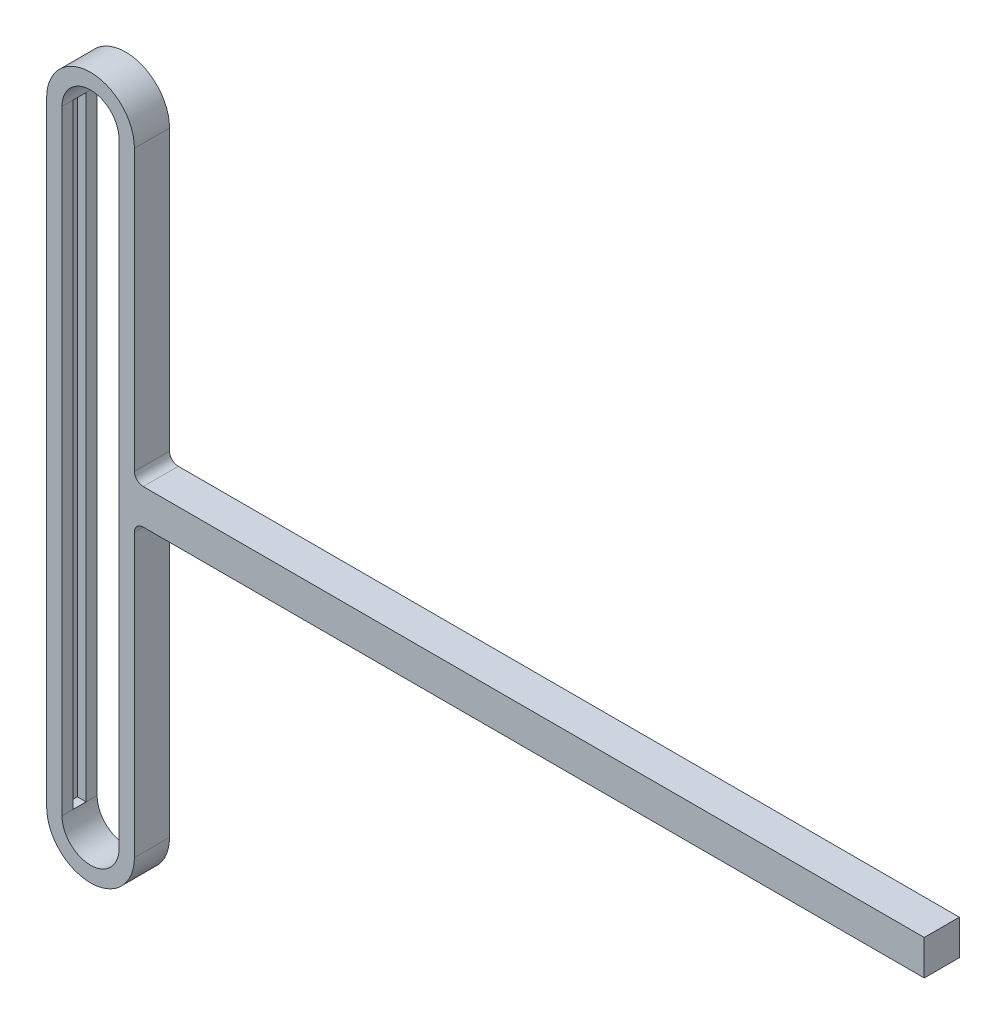
ISO-10303-21;
HEADER;
FILE_DESCRIPTION(('STEP AP214'),'2;1');
FILE_NAME('part.step','',(''),(''),'','','');
FILE_SCHEMA(('AUTOMOTIVE_DESIGN { 1 0 10303 214 1 1 1 1 }'));
ENDSEC;
DATA;
#1=APPLICATION_CONTEXT('core data for automotive mechanical design processes');
#2=APPLICATION_PROTOCOL_DEFINITION('international standard','automotive_design',2000,#1);
#3=PRODUCT_CONTEXT('',#1,'mechanical');
#4=PRODUCT('Part','Part','',(#3));
#5=PRODUCT_RELATED_PRODUCT_CATEGORY('part','',(#4));
#6=PRODUCT_DEFINITION_FORMATION('','',#4);
#7=PRODUCT_DEFINITION_CONTEXT('part definition',#1,'design');
#8=PRODUCT_DEFINITION('design','',#6,#7);
#9=PRODUCT_DEFINITION_SHAPE('','',#8);
#10=(LENGTH_UNIT() NAMED_UNIT(*) SI_UNIT(.MILLI.,.METRE.));
#11=(NAMED_UNIT(*) PLANE_ANGLE_UNIT() SI_UNIT($,.RADIAN.));
#12=(NAMED_UNIT(*) SI_UNIT($,.STERADIAN.) SOLID_ANGLE_UNIT());
#13=UNCERTAINTY_MEASURE_WITH_UNIT(LENGTH_MEASURE(1.E-05),#10,'distance_accuracy_value','');
#14=(GEOMETRIC_REPRESENTATION_CONTEXT(3) GLOBAL_UNCERTAINTY_ASSIGNED_CONTEXT((#13)) GLOBAL_UNIT_ASSIGNED_CONTEXT((#10,
#11,#12)) REPRESENTATION_CONTEXT('',''));
#15=CARTESIAN_POINT('',(0.,0.,0.));
#16=DIRECTION('',(0.,0.,1.));
#17=DIRECTION('',(1.,0.,0.));
#18=AXIS2_PLACEMENT_3D('',#15,#16,#17);
#19=CARTESIAN_POINT('',(50.,400.,40.));
#20=DIRECTION('',(-1.,0.,0.));
#21=DIRECTION('',(0.,-1.,0.));
#22=AXIS2_PLACEMENT_3D('',#19,#20,#21);
#23=PLANE('',#22);
#24=DIRECTION('',(0.,1.,0.));
#25=VECTOR('',#24,1.);
#26=CARTESIAN_POINT('',(50.,400.,40.));
#27=LINE('',#26,#25);
#28=CARTESIAN_POINT('',(50.,31.1797799288488,40.));
#29=VERTEX_POINT('',#28);
#30=CARTESIAN_POINT('',(50.,350.,40.));
#31=VERTEX_POINT('',#30);
#32=EDGE_CURVE('E367',#29,#31,#27,.T.);
#33=ORIENTED_EDGE('',*,*,#32,.F.);
#34=DIRECTION('',(0.,0.,1.));
#35=VECTOR('',#34,1.);
#36=CARTESIAN_POINT('',(50.,31.1797799288488,0.));
#37=LINE('',#36,#35);
#38=CARTESIAN_POINT('',(50.,31.1797799288488,0.));
#39=VERTEX_POINT('',#38);
#40=EDGE_CURVE('E63',#29,#39,#37,.F.);
#41=ORIENTED_EDGE('',*,*,#40,.T.);
#42=DIRECTION('',(0.,1.,0.));
#43=VECTOR('',#42,1.);
#44=CARTESIAN_POINT('',(50.,400.,0.));
#45=LINE('',#44,#43);
#46=CARTESIAN_POINT('',(50.,350.,0.));
#47=VERTEX_POINT('',#46);
#48=EDGE_CURVE('E346',#39,#47,#45,.T.);
#49=ORIENTED_EDGE('',*,*,#48,.T.);
#50=DIRECTION('',(0.,0.,-1.));
#51=VECTOR('',#50,1.);
#52=CARTESIAN_POINT('',(50.,350.,40.));
#53=LINE('',#52,#51);
#54=EDGE_CURVE('E371',#47,#31,#53,.F.);
#55=ORIENTED_EDGE('',*,*,#54,.T.);
#56=EDGE_LOOP('',(#33,#41,#49,#55));
#57=FACE_BOUND('',#56,.T.);
#58=ADVANCED_FACE('F41',(#57),#23,.F.);
#59=CARTESIAN_POINT('',(50.,-350.,0.));
#60=VERTEX_POINT('',#59);
#61=CARTESIAN_POINT('',(50.,-28.8202200711512,0.));
#62=VERTEX_POINT('',#61);
#63=EDGE_CURVE('E372',#60,#62,#45,.T.);
#64=ORIENTED_EDGE('',*,*,#63,.T.);
#65=DIRECTION('',(0.,0.,-1.));
#66=VECTOR('',#65,1.);
#67=CARTESIAN_POINT('',(50.,-28.8202200711512,40.));
#68=LINE('',#67,#66);
#69=CARTESIAN_POINT('',(50.,-28.8202200711512,40.));
#70=VERTEX_POINT('',#69);
#71=EDGE_CURVE('E412',#62,#70,#68,.F.);
#72=ORIENTED_EDGE('',*,*,#71,.T.);
#73=CARTESIAN_POINT('',(50.,-350.,40.));
#74=VERTEX_POINT('',#73);
#75=EDGE_CURVE('E362',#74,#70,#27,.T.);
#76=ORIENTED_EDGE('',*,*,#75,.F.);
#77=DIRECTION('',(0.,0.,-1.));
#78=VECTOR('',#77,1.);
#79=CARTESIAN_POINT('',(50.,-350.,40.));
#80=LINE('',#79,#78);
#81=EDGE_CURVE('E398',#74,#60,#80,.T.);
#82=ORIENTED_EDGE('',*,*,#81,.T.);
#83=EDGE_LOOP('',(#64,#72,#76,#82));
#84=FACE_BOUND('',#83,.T.);
#85=ADVANCED_FACE('F481',(#84),#23,.F.);
#86=CARTESIAN_POINT('',(32.5,350.,40.));
#87=DIRECTION('',(1.,0.,0.));
#88=DIRECTION('',(0.,0.,-1.));
#89=AXIS2_PLACEMENT_3D('',#86,#87,#88);
#90=PLANE('',#89);
#91=DIRECTION('',(0.,1.,0.));
#92=VECTOR('',#91,1.);
#93=CARTESIAN_POINT('',(32.5,350.,12.5000000000001));
#94=LINE('',#93,#92);
#95=CARTESIAN_POINT('',(32.5000000000001,-350.,12.5));
#96=VERTEX_POINT('',#95);
#97=CARTESIAN_POINT('',(32.5,350.,12.5000000000001));
#98=VERTEX_POINT('',#97);
#99=EDGE_CURVE('E216',#96,#98,#94,.T.);
#100=ORIENTED_EDGE('',*,*,#99,.T.);
#101=DIRECTION('',(0.,0.,-1.));
#102=VECTOR('',#101,1.);
#103=CARTESIAN_POINT('',(32.5,350.,40.));
#104=LINE('',#103,#102);
#105=CARTESIAN_POINT('',(32.5,350.,0.));
#106=VERTEX_POINT('',#105);
#107=EDGE_CURVE('E352',#98,#106,#104,.T.);
#108=ORIENTED_EDGE('',*,*,#107,.T.);
#109=DIRECTION('',(0.,-1.,0.));
#110=VECTOR('',#109,1.);
#111=CARTESIAN_POINT('',(32.5,350.,0.));
#112=LINE('',#111,#110);
#113=CARTESIAN_POINT('',(32.5,-350.,0.));
#114=VERTEX_POINT('',#113);
#115=EDGE_CURVE('E315',#106,#114,#112,.T.);
#116=ORIENTED_EDGE('',*,*,#115,.T.);
#117=DIRECTION('',(0.,0.,-1.));
#118=VECTOR('',#117,1.);
#119=CARTESIAN_POINT('',(32.5,-350.,40.));
#120=LINE('',#119,#118);
#121=EDGE_CURVE('E347',#96,#114,#120,.T.);
#122=ORIENTED_EDGE('',*,*,#121,.F.);
#123=EDGE_LOOP('',(#100,#108,#116,#122));
#124=FACE_BOUND('',#123,.T.);
#125=ADVANCED_FACE('F486',(#124),#90,.F.);
#126=DIRECTION('',(0.,-1.,0.));
#127=VECTOR('',#126,1.);
#128=CARTESIAN_POINT('',(32.5,350.,27.5000000000001));
#129=LINE('',#128,#127);
#130=CARTESIAN_POINT('',(32.5,350.,27.5));
#131=VERTEX_POINT('',#130);
#132=CARTESIAN_POINT('',(32.5000000000001,-350.,27.5));
#133=VERTEX_POINT('',#132);
#134=EDGE_CURVE('E245',#131,#133,#129,.T.);
#135=ORIENTED_EDGE('',*,*,#134,.T.);
#136=CARTESIAN_POINT('',(32.5,-350.,40.));
#137=VERTEX_POINT('',#136);
#138=EDGE_CURVE('E342',#137,#133,#120,.T.);
#139=ORIENTED_EDGE('',*,*,#138,.F.);
#140=DIRECTION('',(0.,-1.,0.));
#141=VECTOR('',#140,1.);
#142=CARTESIAN_POINT('',(32.5,350.,40.));
#143=LINE('',#142,#141);
#144=CARTESIAN_POINT('',(32.5,350.,40.));
#145=VERTEX_POINT('',#144);
#146=EDGE_CURVE('E323',#145,#137,#143,.T.);
#147=ORIENTED_EDGE('',*,*,#146,.F.);
#148=EDGE_CURVE('E348',#145,#131,#104,.T.);
#149=ORIENTED_EDGE('',*,*,#148,.T.);
#150=EDGE_LOOP('',(#135,#139,#147,#149));
#151=FACE_BOUND('',#150,.T.);
#152=ADVANCED_FACE('F553',(#151),#90,.F.);
#153=CARTESIAN_POINT('',(-32.5,350.,40.));
#154=DIRECTION('',(-1.,0.,0.));
#155=DIRECTION('',(0.,-1.,0.));
#156=AXIS2_PLACEMENT_3D('',#153,#154,#155);
#157=PLANE('',#156);
#158=DIRECTION('',(0.,0.,-1.));
#159=VECTOR('',#158,1.);
#160=CARTESIAN_POINT('',(-32.5,350.,40.));
#161=LINE('',#160,#159);
#162=CARTESIAN_POINT('',(-32.5,350.,12.5000000000001));
#163=VERTEX_POINT('',#162);
#164=CARTESIAN_POINT('',(-32.5,350.,0.));
#165=VERTEX_POINT('',#164);
#166=EDGE_CURVE('E357',#163,#165,#161,.T.);
#167=ORIENTED_EDGE('',*,*,#166,.F.);
#168=DIRECTION('',(0.,1.,0.));
#169=VECTOR('',#168,1.);
#170=CARTESIAN_POINT('',(-32.5,350.,12.5000000000001));
#171=LINE('',#170,#169);
#172=CARTESIAN_POINT('',(-32.5000000000001,-350.,12.5));
#173=VERTEX_POINT('',#172);
#174=EDGE_CURVE('E256',#173,#163,#171,.T.);
#175=ORIENTED_EDGE('',*,*,#174,.F.);
#176=DIRECTION('',(0.,0.,-1.));
#177=VECTOR('',#176,1.);
#178=CARTESIAN_POINT('',(-32.5000000000001,-350.,40.));
#179=LINE('',#178,#177);
#180=CARTESIAN_POINT('',(-32.5000000000001,-350.,0.));
#181=VERTEX_POINT('',#180);
#182=EDGE_CURVE('E327',#173,#181,#179,.T.);
#183=ORIENTED_EDGE('',*,*,#182,.T.);
#184=DIRECTION('',(0.,1.,0.));
#185=VECTOR('',#184,1.);
#186=CARTESIAN_POINT('',(-32.5,350.,0.));
#187=LINE('',#186,#185);
#188=EDGE_CURVE('E331',#181,#165,#187,.T.);
#189=ORIENTED_EDGE('',*,*,#188,.T.);
#190=EDGE_LOOP('',(#167,#175,#183,#189));
#191=FACE_BOUND('',#190,.T.);
#192=ADVANCED_FACE('F436',(#191),#157,.F.);
#193=CARTESIAN_POINT('',(0.,-350.,0.));
#194=DIRECTION('',(0.,0.,-1.));
#195=DIRECTION('',(-1.,0.,0.));
#196=AXIS2_PLACEMENT_3D('',#193,#194,#195);
#197=CYLINDRICAL_SURFACE('',#196,50.);
#198=DIRECTION('',(0.,0.,-1.));
#199=VECTOR('',#198,1.);
#200=CARTESIAN_POINT('',(-50.,-350.,40.));
#201=LINE('',#200,#199);
#202=CARTESIAN_POINT('',(-50.,-350.,0.));
#203=VERTEX_POINT('',#202);
#204=CARTESIAN_POINT('',(-50.,-350.,40.));
#205=VERTEX_POINT('',#204);
#206=EDGE_CURVE('E394',#203,#205,#201,.F.);
#207=ORIENTED_EDGE('',*,*,#206,.F.);
#208=CARTESIAN_POINT('',(0.,-350.,0.));
#209=DIRECTION('',(0.,0.,1.));
#210=DIRECTION('',(1.,0.,0.));
#211=AXIS2_PLACEMENT_3D('',#208,#209,#210);
#212=CIRCLE('',#211,50.);
#213=EDGE_CURVE('E402',#60,#203,#212,.F.);
#214=ORIENTED_EDGE('',*,*,#213,.F.);
#215=ORIENTED_EDGE('',*,*,#81,.F.);
#216=CARTESIAN_POINT('',(0.,-350.,40.));
#217=DIRECTION('',(0.,0.,1.));
#218=DIRECTION('',(1.,0.,0.));
#219=AXIS2_PLACEMENT_3D('',#216,#217,#218);
#220=CIRCLE('',#219,50.);
#221=EDGE_CURVE('E405',#205,#74,#220,.T.);
#222=ORIENTED_EDGE('',*,*,#221,.F.);
#223=EDGE_LOOP('',(#207,#214,#215,#222));
#224=FACE_BOUND('',#223,.T.);
#225=ADVANCED_FACE('F499',(#224),#197,.T.);
#226=CARTESIAN_POINT('',(0.,350.,0.));
#227=DIRECTION('',(0.,0.,-1.));
#228=DIRECTION('',(-1.,0.,0.));
#229=AXIS2_PLACEMENT_3D('',#226,#227,#228);
#230=CYLINDRICAL_SURFACE('',#229,50.);
#231=ORIENTED_EDGE('',*,*,#54,.F.);
#232=CARTESIAN_POINT('',(0.,350.,0.));
#233=DIRECTION('',(0.,0.,1.));
#234=DIRECTION('',(1.,0.,0.));
#235=AXIS2_PLACEMENT_3D('',#232,#233,#234);
#236=CIRCLE('',#235,50.);
#237=CARTESIAN_POINT('',(-50.,350.,0.));
#238=VERTEX_POINT('',#237);
#239=EDGE_CURVE('E387',#238,#47,#236,.F.);
#240=ORIENTED_EDGE('',*,*,#239,.F.);
#241=DIRECTION('',(0.,0.,-1.));
#242=VECTOR('',#241,1.);
#243=CARTESIAN_POINT('',(-50.,350.,40.));
#244=LINE('',#243,#242);
#245=CARTESIAN_POINT('',(-50.,350.,40.));
#246=VERTEX_POINT('',#245);
#247=EDGE_CURVE('E383',#246,#238,#244,.T.);
#248=ORIENTED_EDGE('',*,*,#247,.F.);
#249=CARTESIAN_POINT('',(0.,350.,40.));
#250=DIRECTION('',(0.,0.,1.));
#251=DIRECTION('',(1.,0.,0.));
#252=AXIS2_PLACEMENT_3D('',#249,#250,#251);
#253=CIRCLE('',#252,50.);
#254=EDGE_CURVE('E391',#31,#246,#253,.T.);
#255=ORIENTED_EDGE('',*,*,#254,.F.);
#256=EDGE_LOOP('',(#231,#240,#248,#255));
#257=FACE_BOUND('',#256,.T.);
#258=ADVANCED_FACE('F493',(#257),#230,.T.);
#259=CARTESIAN_POINT('',(-50.0000000000001,400.,40.));
#260=DIRECTION('',(1.,0.,0.));
#261=DIRECTION('',(0.,1.,0.));
#262=AXIS2_PLACEMENT_3D('',#259,#260,#261);
#263=PLANE('',#262);
#264=DIRECTION('',(0.,-1.,0.));
#265=VECTOR('',#264,1.);
#266=CARTESIAN_POINT('',(-50.0000000000001,400.,0.));
#267=LINE('',#266,#265);
#268=EDGE_CURVE('E376',#238,#203,#267,.T.);
#269=ORIENTED_EDGE('',*,*,#268,.T.);
#270=ORIENTED_EDGE('',*,*,#206,.T.);
#271=DIRECTION('',(0.,-1.,0.));
#272=VECTOR('',#271,1.);
#273=CARTESIAN_POINT('',(-50.0000000000001,400.,40.));
#274=LINE('',#273,#272);
#275=EDGE_CURVE('E366',#246,#205,#274,.T.);
#276=ORIENTED_EDGE('',*,*,#275,.F.);
#277=ORIENTED_EDGE('',*,*,#247,.T.);
#278=EDGE_LOOP('',(#269,#270,#276,#277));
#279=FACE_BOUND('',#278,.T.);
#280=ADVANCED_FACE('F490',(#279),#263,.F.);
#281=CARTESIAN_POINT('',(0.,0.,40.));
#282=DIRECTION('',(0.,0.,1.));
#283=DIRECTION('',(1.,0.,0.));
#284=AXIS2_PLACEMENT_3D('',#281,#282,#283);
#285=PLANE('',#284);
#286=CARTESIAN_POINT('',(0.,-350.,40.));
#287=DIRECTION('',(0.,0.,-1.));
#288=DIRECTION('',(-1.,0.,0.));
#289=AXIS2_PLACEMENT_3D('',#286,#287,#288);
#290=CIRCLE('',#289,32.5000000000001);
#291=CARTESIAN_POINT('',(-32.5000000000001,-350.,40.));
#292=VERTEX_POINT('',#291);
#293=EDGE_CURVE('E310',#137,#292,#290,.T.);
#294=ORIENTED_EDGE('',*,*,#293,.T.);
#295=DIRECTION('',(0.,1.,0.));
#296=VECTOR('',#295,1.);
#297=CARTESIAN_POINT('',(-32.5,350.,40.));
#298=LINE('',#297,#296);
#299=CARTESIAN_POINT('',(-32.5,350.,40.));
#300=VERTEX_POINT('',#299);
#301=EDGE_CURVE('E314',#292,#300,#298,.T.);
#302=ORIENTED_EDGE('',*,*,#301,.T.);
#303=CARTESIAN_POINT('',(0.,350.,40.));
#304=DIRECTION('',(0.,0.,-1.));
#305=DIRECTION('',(1.,0.,0.));
#306=AXIS2_PLACEMENT_3D('',#303,#304,#305);
#307=CIRCLE('',#306,32.5);
#308=EDGE_CURVE('E319',#300,#145,#307,.T.);
#309=ORIENTED_EDGE('',*,*,#308,.T.);
#310=ORIENTED_EDGE('',*,*,#146,.T.);
#311=EDGE_LOOP('',(#294,#302,#309,#310));
#312=FACE_BOUND('',#311,.T.);
#313=ORIENTED_EDGE('',*,*,#275,.T.);
#314=ORIENTED_EDGE('',*,*,#221,.T.);
#315=ORIENTED_EDGE('',*,*,#75,.T.);
#316=CARTESIAN_POINT('',(59.9999999999999,-28.8202200711512,40.));
#317=DIRECTION('',(0.,0.,1.));
#318=DIRECTION('',(1.,0.,0.));
#319=AXIS2_PLACEMENT_3D('',#316,#317,#318);
#320=CIRCLE('',#319,10.);
#321=CARTESIAN_POINT('',(59.9999999999999,-18.8202200711512,40.));
#322=VERTEX_POINT('',#321);
#323=EDGE_CURVE('E423',#70,#322,#320,.F.);
#324=ORIENTED_EDGE('',*,*,#323,.T.);
#325=DIRECTION('',(-1.,0.,0.));
#326=VECTOR('',#325,1.);
#327=CARTESIAN_POINT('',(950.,-18.8202200711511,40.));
#328=LINE('',#327,#326);
#329=CARTESIAN_POINT('',(950.,-18.8202200711511,40.));
#330=VERTEX_POINT('',#329);
#331=EDGE_CURVE('E223',#330,#322,#328,.T.);
#332=ORIENTED_EDGE('',*,*,#331,.F.);
#333=DIRECTION('',(0.,-1.,0.));
#334=VECTOR('',#333,1.);
#335=CARTESIAN_POINT('',(950.,21.1797799288489,40.));
#336=LINE('',#335,#334);
#337=CARTESIAN_POINT('',(950.,21.1797799288489,40.));
#338=VERTEX_POINT('',#337);
#339=EDGE_CURVE('E200',#338,#330,#336,.T.);
#340=ORIENTED_EDGE('',*,*,#339,.F.);
#341=DIRECTION('',(-1.,0.,0.));
#342=VECTOR('',#341,1.);
#343=CARTESIAN_POINT('',(950.,21.1797799288489,40.));
#344=LINE('',#343,#342);
#345=CARTESIAN_POINT('',(59.9999999999999,21.1797799288488,40.));
#346=VERTEX_POINT('',#345);
#347=EDGE_CURVE('E196',#338,#346,#344,.T.);
#348=ORIENTED_EDGE('',*,*,#347,.T.);
#349=CARTESIAN_POINT('',(59.9999999999999,31.1797799288488,40.));
#350=DIRECTION('',(0.,0.,1.));
#351=DIRECTION('',(1.,0.,0.));
#352=AXIS2_PLACEMENT_3D('',#349,#350,#351);
#353=CIRCLE('',#352,10.);
#354=EDGE_CURVE('E50',#346,#29,#353,.F.);
#355=ORIENTED_EDGE('',*,*,#354,.T.);
#356=ORIENTED_EDGE('',*,*,#32,.T.);
#357=ORIENTED_EDGE('',*,*,#254,.T.);
#358=EDGE_LOOP('',(#313,#314,#315,#324,#332,#340,#348,#355,#356,#357));
#359=FACE_BOUND('',#358,.T.);
#360=ADVANCED_FACE('F520',(#312,#359),#285,.T.);
#361=CARTESIAN_POINT('',(0.,0.,0.));
#362=DIRECTION('',(0.,0.,1.));
#363=DIRECTION('',(1.,0.,0.));
#364=AXIS2_PLACEMENT_3D('',#361,#362,#363);
#365=PLANE('',#364);
#366=ORIENTED_EDGE('',*,*,#188,.F.);
#367=CARTESIAN_POINT('',(0.,-350.,0.));
#368=DIRECTION('',(0.,0.,-1.));
#369=DIRECTION('',(-1.,0.,0.));
#370=AXIS2_PLACEMENT_3D('',#367,#368,#369);
#371=CIRCLE('',#370,32.5000000000001);
#372=EDGE_CURVE('E300',#114,#181,#371,.T.);
#373=ORIENTED_EDGE('',*,*,#372,.F.);
#374=ORIENTED_EDGE('',*,*,#115,.F.);
#375=CARTESIAN_POINT('',(0.,350.,0.));
#376=DIRECTION('',(0.,0.,-1.));
#377=DIRECTION('',(1.,0.,0.));
#378=AXIS2_PLACEMENT_3D('',#375,#376,#377);
#379=CIRCLE('',#378,32.5);
#380=EDGE_CURVE('E335',#165,#106,#379,.T.);
#381=ORIENTED_EDGE('',*,*,#380,.F.);
#382=EDGE_LOOP('',(#366,#373,#374,#381));
#383=FACE_BOUND('',#382,.T.);
#384=ORIENTED_EDGE('',*,*,#63,.F.);
#385=ORIENTED_EDGE('',*,*,#213,.T.);
#386=ORIENTED_EDGE('',*,*,#268,.F.);
#387=ORIENTED_EDGE('',*,*,#239,.T.);
#388=ORIENTED_EDGE('',*,*,#48,.F.);
#389=CARTESIAN_POINT('',(59.9999999999999,31.1797799288488,0.));
#390=DIRECTION('',(0.,0.,1.));
#391=DIRECTION('',(1.,0.,0.));
#392=AXIS2_PLACEMENT_3D('',#389,#390,#391);
#393=CIRCLE('',#392,10.);
#394=CARTESIAN_POINT('',(59.9999999999999,21.1797799288488,0.));
#395=VERTEX_POINT('',#394);
#396=EDGE_CURVE('E11',#39,#395,#393,.T.);
#397=ORIENTED_EDGE('',*,*,#396,.T.);
#398=DIRECTION('',(-1.,0.,0.));
#399=VECTOR('',#398,1.);
#400=CARTESIAN_POINT('',(950.,21.1797799288489,0.));
#401=LINE('',#400,#399);
#402=CARTESIAN_POINT('',(950.,21.1797799288489,0.));
#403=VERTEX_POINT('',#402);
#404=EDGE_CURVE('E194',#403,#395,#401,.T.);
#405=ORIENTED_EDGE('',*,*,#404,.F.);
#406=DIRECTION('',(0.,1.,0.));
#407=VECTOR('',#406,1.);
#408=CARTESIAN_POINT('',(950.,21.1797799288489,0.));
#409=LINE('',#408,#407);
#410=CARTESIAN_POINT('',(950.,-18.8202200711511,0.));
#411=VERTEX_POINT('',#410);
#412=EDGE_CURVE('E201',#411,#403,#409,.T.);
#413=ORIENTED_EDGE('',*,*,#412,.F.);
#414=DIRECTION('',(-1.,0.,0.));
#415=VECTOR('',#414,1.);
#416=CARTESIAN_POINT('',(950.,-18.8202200711511,0.));
#417=LINE('',#416,#415);
#418=CARTESIAN_POINT('',(59.9999999999999,-18.8202200711512,0.));
#419=VERTEX_POINT('',#418);
#420=EDGE_CURVE('E524',#411,#419,#417,.T.);
#421=ORIENTED_EDGE('',*,*,#420,.T.);
#422=CARTESIAN_POINT('',(59.9999999999999,-28.8202200711512,0.));
#423=DIRECTION('',(0.,0.,1.));
#424=DIRECTION('',(1.,0.,0.));
#425=AXIS2_PLACEMENT_3D('',#422,#423,#424);
#426=CIRCLE('',#425,10.);
#427=EDGE_CURVE('E420',#419,#62,#426,.T.);
#428=ORIENTED_EDGE('',*,*,#427,.T.);
#429=EDGE_LOOP('',(#384,#385,#386,#387,#388,#397,#405,#413,#421,#428));
#430=FACE_BOUND('',#429,.T.);
#431=ADVANCED_FACE('F213',(#383,#430),#365,.F.);
#432=CARTESIAN_POINT('',(0.,-350.,40.));
#433=DIRECTION('',(0.,0.,-1.));
#434=DIRECTION('',(-1.,0.,0.));
#435=AXIS2_PLACEMENT_3D('',#432,#433,#434);
#436=CYLINDRICAL_SURFACE('',#435,32.5000000000001);
#437=ORIENTED_EDGE('',*,*,#372,.T.);
#438=ORIENTED_EDGE('',*,*,#182,.F.);
#439=DIRECTION('',(0.,0.,-1.));
#440=VECTOR('',#439,1.);
#441=CARTESIAN_POINT('',(-32.5000000000001,-350.,27.5));
#442=LINE('',#441,#440);
#443=CARTESIAN_POINT('',(-32.5000000000001,-350.,27.5));
#444=VERTEX_POINT('',#443);
#445=EDGE_CURVE('E271',#444,#173,#442,.T.);
#446=ORIENTED_EDGE('',*,*,#445,.F.);
#447=EDGE_CURVE('E358',#292,#444,#179,.T.);
#448=ORIENTED_EDGE('',*,*,#447,.F.);
#449=ORIENTED_EDGE('',*,*,#293,.F.);
#450=ORIENTED_EDGE('',*,*,#138,.T.);
#451=DIRECTION('',(0.,0.,-1.));
#452=VECTOR('',#451,1.);
#453=CARTESIAN_POINT('',(32.5000000000001,-350.,27.5));
#454=LINE('',#453,#452);
#455=EDGE_CURVE('E221',#133,#96,#454,.T.);
#456=ORIENTED_EDGE('',*,*,#455,.T.);
#457=ORIENTED_EDGE('',*,*,#121,.T.);
#458=EDGE_LOOP('',(#437,#438,#446,#448,#449,#450,#456,#457));
#459=FACE_BOUND('',#458,.T.);
#460=ADVANCED_FACE('F442',(#459),#436,.F.);
#461=CARTESIAN_POINT('',(0.,350.,40.));
#462=DIRECTION('',(0.,0.,-1.));
#463=DIRECTION('',(-1.,0.,0.));
#464=AXIS2_PLACEMENT_3D('',#461,#462,#463);
#465=CYLINDRICAL_SURFACE('',#464,32.5);
#466=ORIENTED_EDGE('',*,*,#380,.T.);
#467=ORIENTED_EDGE('',*,*,#107,.F.);
#468=DIRECTION('',(0.,0.,1.));
#469=VECTOR('',#468,1.);
#470=CARTESIAN_POINT('',(32.5,350.,27.5000000000001));
#471=LINE('',#470,#469);
#472=EDGE_CURVE('E232',#98,#131,#471,.T.);
#473=ORIENTED_EDGE('',*,*,#472,.T.);
#474=ORIENTED_EDGE('',*,*,#148,.F.);
#475=ORIENTED_EDGE('',*,*,#308,.F.);
#476=CARTESIAN_POINT('',(-32.5,350.,27.5000000000001));
#477=VERTEX_POINT('',#476);
#478=EDGE_CURVE('E353',#300,#477,#161,.T.);
#479=ORIENTED_EDGE('',*,*,#478,.T.);
#480=DIRECTION('',(0.,0.,1.));
#481=VECTOR('',#480,1.);
#482=CARTESIAN_POINT('',(-32.5,350.,27.5000000000001));
#483=LINE('',#482,#481);
#484=EDGE_CURVE('E286',#163,#477,#483,.T.);
#485=ORIENTED_EDGE('',*,*,#484,.F.);
#486=ORIENTED_EDGE('',*,*,#166,.T.);
#487=EDGE_LOOP('',(#466,#467,#473,#474,#475,#479,#485,#486));
#488=FACE_BOUND('',#487,.T.);
#489=ADVANCED_FACE('F448',(#488),#465,.F.);
#490=ORIENTED_EDGE('',*,*,#447,.T.);
#491=DIRECTION('',(0.,-1.,0.));
#492=VECTOR('',#491,1.);
#493=CARTESIAN_POINT('',(-32.5,350.,27.5000000000001));
#494=LINE('',#493,#492);
#495=EDGE_CURVE('E290',#477,#444,#494,.T.);
#496=ORIENTED_EDGE('',*,*,#495,.F.);
#497=ORIENTED_EDGE('',*,*,#478,.F.);
#498=ORIENTED_EDGE('',*,*,#301,.F.);
#499=EDGE_LOOP('',(#490,#496,#497,#498));
#500=FACE_BOUND('',#499,.T.);
#501=ADVANCED_FACE('F457',(#500),#157,.F.);
#502=CARTESIAN_POINT('',(-42.5,350.,12.5000000000001));
#503=DIRECTION('',(0.,0.,-1.));
#504=DIRECTION('',(0.,1.,0.));
#505=AXIS2_PLACEMENT_3D('',#502,#503,#504);
#506=PLANE('',#505);
#507=ORIENTED_EDGE('',*,*,#174,.T.);
#508=DIRECTION('',(1.,0.,0.));
#509=VECTOR('',#508,1.);
#510=CARTESIAN_POINT('',(-42.5,350.,12.5000000000001));
#511=LINE('',#510,#509);
#512=CARTESIAN_POINT('',(-42.5,350.,12.5000000000001));
#513=VERTEX_POINT('',#512);
#514=EDGE_CURVE('E283',#513,#163,#511,.T.);
#515=ORIENTED_EDGE('',*,*,#514,.F.);
#516=DIRECTION('',(0.,1.,0.));
#517=VECTOR('',#516,1.);
#518=CARTESIAN_POINT('',(-42.5,350.,12.5000000000001));
#519=LINE('',#518,#517);
#520=CARTESIAN_POINT('',(-42.5000000000001,-350.,12.5));
#521=VERTEX_POINT('',#520);
#522=EDGE_CURVE('E266',#521,#513,#519,.T.);
#523=ORIENTED_EDGE('',*,*,#522,.F.);
#524=DIRECTION('',(1.,0.,0.));
#525=VECTOR('',#524,1.);
#526=CARTESIAN_POINT('',(-42.5000000000001,-350.,12.5));
#527=LINE('',#526,#525);
#528=EDGE_CURVE('E297',#521,#173,#527,.T.);
#529=ORIENTED_EDGE('',*,*,#528,.T.);
#530=EDGE_LOOP('',(#507,#515,#523,#529));
#531=FACE_BOUND('',#530,.T.);
#532=ADVANCED_FACE('F469',(#531),#506,.F.);
#533=CARTESIAN_POINT('',(-42.5000000000001,-350.,27.5));
#534=DIRECTION('',(0.,-1.,0.));
#535=DIRECTION('',(1.,0.,0.));
#536=AXIS2_PLACEMENT_3D('',#533,#534,#535);
#537=PLANE('',#536);
#538=ORIENTED_EDGE('',*,*,#445,.T.);
#539=ORIENTED_EDGE('',*,*,#528,.F.);
#540=DIRECTION('',(0.,0.,-1.));
#541=VECTOR('',#540,1.);
#542=CARTESIAN_POINT('',(-42.5000000000001,-350.,27.5));
#543=LINE('',#542,#541);
#544=CARTESIAN_POINT('',(-42.5000000000001,-350.,27.5));
#545=VERTEX_POINT('',#544);
#546=EDGE_CURVE('E279',#545,#521,#543,.T.);
#547=ORIENTED_EDGE('',*,*,#546,.F.);
#548=DIRECTION('',(1.,0.,0.));
#549=VECTOR('',#548,1.);
#550=CARTESIAN_POINT('',(-42.5000000000001,-350.,27.5));
#551=LINE('',#550,#549);
#552=EDGE_CURVE('E301',#545,#444,#551,.T.);
#553=ORIENTED_EDGE('',*,*,#552,.T.);
#554=EDGE_LOOP('',(#538,#539,#547,#553));
#555=FACE_BOUND('',#554,.T.);
#556=ADVANCED_FACE('F463',(#555),#537,.F.);
#557=CARTESIAN_POINT('',(-42.5,350.,27.5000000000001));
#558=DIRECTION('',(0.,0.,1.));
#559=DIRECTION('',(0.,-1.,0.));
#560=AXIS2_PLACEMENT_3D('',#557,#558,#559);
#561=PLANE('',#560);
#562=ORIENTED_EDGE('',*,*,#495,.T.);
#563=ORIENTED_EDGE('',*,*,#552,.F.);
#564=DIRECTION('',(0.,-1.,0.));
#565=VECTOR('',#564,1.);
#566=CARTESIAN_POINT('',(-42.5,350.,27.5000000000001));
#567=LINE('',#566,#565);
#568=CARTESIAN_POINT('',(-42.5,350.,27.5000000000001));
#569=VERTEX_POINT('',#568);
#570=EDGE_CURVE('E275',#569,#545,#567,.T.);
#571=ORIENTED_EDGE('',*,*,#570,.F.);
#572=DIRECTION('',(1.,0.,0.));
#573=VECTOR('',#572,1.);
#574=CARTESIAN_POINT('',(-42.5,350.,27.5000000000001));
#575=LINE('',#574,#573);
#576=EDGE_CURVE('E304',#569,#477,#575,.T.);
#577=ORIENTED_EDGE('',*,*,#576,.T.);
#578=EDGE_LOOP('',(#562,#563,#571,#577));
#579=FACE_BOUND('',#578,.T.);
#580=ADVANCED_FACE('F460',(#579),#561,.F.);
#581=CARTESIAN_POINT('',(-42.5,350.,27.5000000000001));
#582=DIRECTION('',(0.,1.,0.));
#583=DIRECTION('',(-1.,0.,0.));
#584=AXIS2_PLACEMENT_3D('',#581,#582,#583);
#585=PLANE('',#584);
#586=ORIENTED_EDGE('',*,*,#484,.T.);
#587=ORIENTED_EDGE('',*,*,#576,.F.);
#588=DIRECTION('',(0.,0.,1.));
#589=VECTOR('',#588,1.);
#590=CARTESIAN_POINT('',(-42.5,350.,27.5000000000001));
#591=LINE('',#590,#589);
#592=EDGE_CURVE('E270',#513,#569,#591,.T.);
#593=ORIENTED_EDGE('',*,*,#592,.F.);
#594=ORIENTED_EDGE('',*,*,#514,.T.);
#595=EDGE_LOOP('',(#586,#587,#593,#594));
#596=FACE_BOUND('',#595,.T.);
#597=ADVANCED_FACE('F453',(#596),#585,.F.);
#598=CARTESIAN_POINT('',(-42.5,0.,0.));
#599=DIRECTION('',(1.,0.,0.));
#600=DIRECTION('',(0.,1.,0.));
#601=AXIS2_PLACEMENT_3D('',#598,#599,#600);
#602=PLANE('',#601);
#603=ORIENTED_EDGE('',*,*,#522,.T.);
#604=ORIENTED_EDGE('',*,*,#592,.T.);
#605=ORIENTED_EDGE('',*,*,#570,.T.);
#606=ORIENTED_EDGE('',*,*,#546,.T.);
#607=EDGE_LOOP('',(#603,#604,#605,#606));
#608=FACE_BOUND('',#607,.T.);
#609=ADVANCED_FACE('F467',(#608),#602,.T.);
#610=CARTESIAN_POINT('',(42.5,350.,12.5000000000001));
#611=DIRECTION('',(0.,0.,1.));
#612=DIRECTION('',(0.,-1.,0.));
#613=AXIS2_PLACEMENT_3D('',#610,#611,#612);
#614=PLANE('',#613);
#615=ORIENTED_EDGE('',*,*,#99,.F.);
#616=DIRECTION('',(-1.,0.,0.));
#617=VECTOR('',#616,1.);
#618=CARTESIAN_POINT('',(42.5000000000001,-350.,12.5));
#619=LINE('',#618,#617);
#620=CARTESIAN_POINT('',(42.5000000000001,-350.,12.5));
#621=VERTEX_POINT('',#620);
#622=EDGE_CURVE('E240',#621,#96,#619,.T.);
#623=ORIENTED_EDGE('',*,*,#622,.F.);
#624=DIRECTION('',(0.,1.,0.));
#625=VECTOR('',#624,1.);
#626=CARTESIAN_POINT('',(42.5,350.,12.5000000000001));
#627=LINE('',#626,#625);
#628=CARTESIAN_POINT('',(42.5,350.,12.5000000000001));
#629=VERTEX_POINT('',#628);
#630=EDGE_CURVE('E227',#621,#629,#627,.T.);
#631=ORIENTED_EDGE('',*,*,#630,.T.);
#632=DIRECTION('',(-1.,0.,0.));
#633=VECTOR('',#632,1.);
#634=CARTESIAN_POINT('',(42.5,350.,12.5000000000001));
#635=LINE('',#634,#633);
#636=EDGE_CURVE('E252',#629,#98,#635,.T.);
#637=ORIENTED_EDGE('',*,*,#636,.T.);
#638=EDGE_LOOP('',(#615,#623,#631,#637));
#639=FACE_BOUND('',#638,.T.);
#640=ADVANCED_FACE('F562',(#639),#614,.T.);
#641=CARTESIAN_POINT('',(42.5,350.,27.5000000000001));
#642=DIRECTION('',(0.,-1.,0.));
#643=DIRECTION('',(1.,0.,0.));
#644=AXIS2_PLACEMENT_3D('',#641,#642,#643);
#645=PLANE('',#644);
#646=ORIENTED_EDGE('',*,*,#472,.F.);
#647=ORIENTED_EDGE('',*,*,#636,.F.);
#648=DIRECTION('',(0.,0.,1.));
#649=VECTOR('',#648,1.);
#650=CARTESIAN_POINT('',(42.5,350.,27.5000000000001));
#651=LINE('',#650,#649);
#652=CARTESIAN_POINT('',(42.5,350.,27.5000000000001));
#653=VERTEX_POINT('',#652);
#654=EDGE_CURVE('E238',#629,#653,#651,.T.);
#655=ORIENTED_EDGE('',*,*,#654,.T.);
#656=DIRECTION('',(-1.,0.,0.));
#657=VECTOR('',#656,1.);
#658=CARTESIAN_POINT('',(42.5,350.,27.5000000000001));
#659=LINE('',#658,#657);
#660=EDGE_CURVE('E257',#653,#131,#659,.T.);
#661=ORIENTED_EDGE('',*,*,#660,.T.);
#662=EDGE_LOOP('',(#646,#647,#655,#661));
#663=FACE_BOUND('',#662,.T.);
#664=ADVANCED_FACE('F566',(#663),#645,.T.);
#665=CARTESIAN_POINT('',(42.5,350.,27.5000000000001));
#666=DIRECTION('',(0.,0.,-1.));
#667=DIRECTION('',(0.,1.,0.));
#668=AXIS2_PLACEMENT_3D('',#665,#666,#667);
#669=PLANE('',#668);
#670=ORIENTED_EDGE('',*,*,#134,.F.);
#671=ORIENTED_EDGE('',*,*,#660,.F.);
#672=DIRECTION('',(0.,-1.,0.));
#673=VECTOR('',#672,1.);
#674=CARTESIAN_POINT('',(42.5,350.,27.5000000000001));
#675=LINE('',#674,#673);
#676=CARTESIAN_POINT('',(42.5000000000001,-350.,27.5));
#677=VERTEX_POINT('',#676);
#678=EDGE_CURVE('E235',#653,#677,#675,.T.);
#679=ORIENTED_EDGE('',*,*,#678,.T.);
#680=DIRECTION('',(-1.,0.,0.));
#681=VECTOR('',#680,1.);
#682=CARTESIAN_POINT('',(42.5000000000001,-350.,27.5));
#683=LINE('',#682,#681);
#684=EDGE_CURVE('E261',#677,#133,#683,.T.);
#685=ORIENTED_EDGE('',*,*,#684,.T.);
#686=EDGE_LOOP('',(#670,#671,#679,#685));
#687=FACE_BOUND('',#686,.T.);
#688=ADVANCED_FACE('F578',(#687),#669,.T.);
#689=CARTESIAN_POINT('',(42.5000000000001,-350.,27.5));
#690=DIRECTION('',(0.,1.,0.));
#691=DIRECTION('',(-1.,0.,0.));
#692=AXIS2_PLACEMENT_3D('',#689,#690,#691);
#693=PLANE('',#692);
#694=ORIENTED_EDGE('',*,*,#455,.F.);
#695=ORIENTED_EDGE('',*,*,#684,.F.);
#696=DIRECTION('',(0.,0.,-1.));
#697=VECTOR('',#696,1.);
#698=CARTESIAN_POINT('',(42.5000000000001,-350.,27.5));
#699=LINE('',#698,#697);
#700=EDGE_CURVE('E231',#677,#621,#699,.T.);
#701=ORIENTED_EDGE('',*,*,#700,.T.);
#702=ORIENTED_EDGE('',*,*,#622,.T.);
#703=EDGE_LOOP('',(#694,#695,#701,#702));
#704=FACE_BOUND('',#703,.T.);
#705=ADVANCED_FACE('F572',(#704),#693,.T.);
#706=CARTESIAN_POINT('',(42.5,0.,0.));
#707=DIRECTION('',(-1.,0.,0.));
#708=DIRECTION('',(0.,1.,0.));
#709=AXIS2_PLACEMENT_3D('',#706,#707,#708);
#710=PLANE('',#709);
#711=ORIENTED_EDGE('',*,*,#630,.F.);
#712=ORIENTED_EDGE('',*,*,#700,.F.);
#713=ORIENTED_EDGE('',*,*,#678,.F.);
#714=ORIENTED_EDGE('',*,*,#654,.F.);
#715=EDGE_LOOP('',(#711,#712,#713,#714));
#716=FACE_BOUND('',#715,.T.);
#717=ADVANCED_FACE('F576',(#716),#710,.T.);
#718=CARTESIAN_POINT('',(950.,21.1797799288489,40.));
#719=DIRECTION('',(0.,-1.,0.));
#720=DIRECTION('',(1.,0.,0.));
#721=AXIS2_PLACEMENT_3D('',#718,#719,#720);
#722=PLANE('',#721);
#723=ORIENTED_EDGE('',*,*,#404,.T.);
#724=DIRECTION('',(0.,0.,1.));
#725=VECTOR('',#724,1.);
#726=CARTESIAN_POINT('',(59.9999999999999,21.1797799288488,40.));
#727=LINE('',#726,#725);
#728=EDGE_CURVE('E415',#395,#346,#727,.T.);
#729=ORIENTED_EDGE('',*,*,#728,.T.);
#730=ORIENTED_EDGE('',*,*,#347,.F.);
#731=DIRECTION('',(0.,0.,1.));
#732=VECTOR('',#731,1.);
#733=CARTESIAN_POINT('',(950.,21.1797799288489,40.));
#734=LINE('',#733,#732);
#735=EDGE_CURVE('E189',#403,#338,#734,.T.);
#736=ORIENTED_EDGE('',*,*,#735,.F.);
#737=EDGE_LOOP('',(#723,#729,#730,#736));
#738=FACE_BOUND('',#737,.T.);
#739=ADVANCED_FACE('F191',(#738),#722,.F.);
#740=CARTESIAN_POINT('',(950.,-18.8202200711511,40.));
#741=DIRECTION('',(0.,1.,0.));
#742=DIRECTION('',(0.,0.,1.));
#743=AXIS2_PLACEMENT_3D('',#740,#741,#742);
#744=PLANE('',#743);
#745=ORIENTED_EDGE('',*,*,#331,.T.);
#746=DIRECTION('',(0.,0.,-1.));
#747=VECTOR('',#746,1.);
#748=CARTESIAN_POINT('',(59.9999999999999,-18.8202200711512,0.));
#749=LINE('',#748,#747);
#750=EDGE_CURVE('E408',#322,#419,#749,.T.);
#751=ORIENTED_EDGE('',*,*,#750,.T.);
#752=ORIENTED_EDGE('',*,*,#420,.F.);
#753=DIRECTION('',(0.,0.,-1.));
#754=VECTOR('',#753,1.);
#755=CARTESIAN_POINT('',(950.,-18.8202200711511,40.));
#756=LINE('',#755,#754);
#757=EDGE_CURVE('E206',#330,#411,#756,.T.);
#758=ORIENTED_EDGE('',*,*,#757,.F.);
#759=EDGE_LOOP('',(#745,#751,#752,#758));
#760=FACE_BOUND('',#759,.T.);
#761=ADVANCED_FACE('F513',(#760),#744,.F.);
#762=CARTESIAN_POINT('',(950.,0.,0.));
#763=DIRECTION('',(1.,0.,0.));
#764=DIRECTION('',(0.,0.,-1.));
#765=AXIS2_PLACEMENT_3D('',#762,#763,#764);
#766=PLANE('',#765);
#767=ORIENTED_EDGE('',*,*,#412,.T.);
#768=ORIENTED_EDGE('',*,*,#735,.T.);
#769=ORIENTED_EDGE('',*,*,#339,.T.);
#770=ORIENTED_EDGE('',*,*,#757,.T.);
#771=EDGE_LOOP('',(#767,#768,#769,#770));
#772=FACE_BOUND('',#771,.T.);
#773=ADVANCED_FACE('F204',(#772),#766,.T.);
#774=CARTESIAN_POINT('',(59.9999999999999,-28.8202200711512,40.));
#775=DIRECTION('',(0.,0.,1.));
#776=DIRECTION('',(0.,-1.,0.));
#777=AXIS2_PLACEMENT_3D('',#774,#775,#776);
#778=CYLINDRICAL_SURFACE('',#777,10.);
#779=ORIENTED_EDGE('',*,*,#323,.F.);
#780=ORIENTED_EDGE('',*,*,#71,.F.);
#781=ORIENTED_EDGE('',*,*,#427,.F.);
#782=ORIENTED_EDGE('',*,*,#750,.F.);
#783=EDGE_LOOP('',(#779,#780,#781,#782));
#784=FACE_BOUND('',#783,.T.);
#785=ADVANCED_FACE('F505',(#784),#778,.F.);
#786=CARTESIAN_POINT('',(59.9999999999999,31.1797799288488,40.));
#787=DIRECTION('',(0.,0.,-1.));
#788=DIRECTION('',(-1.,0.,0.));
#789=AXIS2_PLACEMENT_3D('',#786,#787,#788);
#790=CYLINDRICAL_SURFACE('',#789,10.);
#791=ORIENTED_EDGE('',*,*,#396,.F.);
#792=ORIENTED_EDGE('',*,*,#40,.F.);
#793=ORIENTED_EDGE('',*,*,#354,.F.);
#794=ORIENTED_EDGE('',*,*,#728,.F.);
#795=EDGE_LOOP('',(#791,#792,#793,#794));
#796=FACE_BOUND('',#795,.T.);
#797=ADVANCED_FACE('F43',(#796),#790,.F.);
#798=CLOSED_SHELL('',(#58,#85,#125,#152,#192,#225,#258,#280,#360,#431,#460,#489,#501,#532,#556,
#580,#597,#609,#640,#664,#688,#705,#717,#739,#761,#773,#785,#797));
#799=MANIFOLD_SOLID_BREP('B2',#798);
#800=ADVANCED_BREP_SHAPE_REPRESENTATION('',(#18,#799),#14);
#801=SHAPE_DEFINITION_REPRESENTATION(#9,#800);
ENDSEC;
END-ISO-10303-21;
